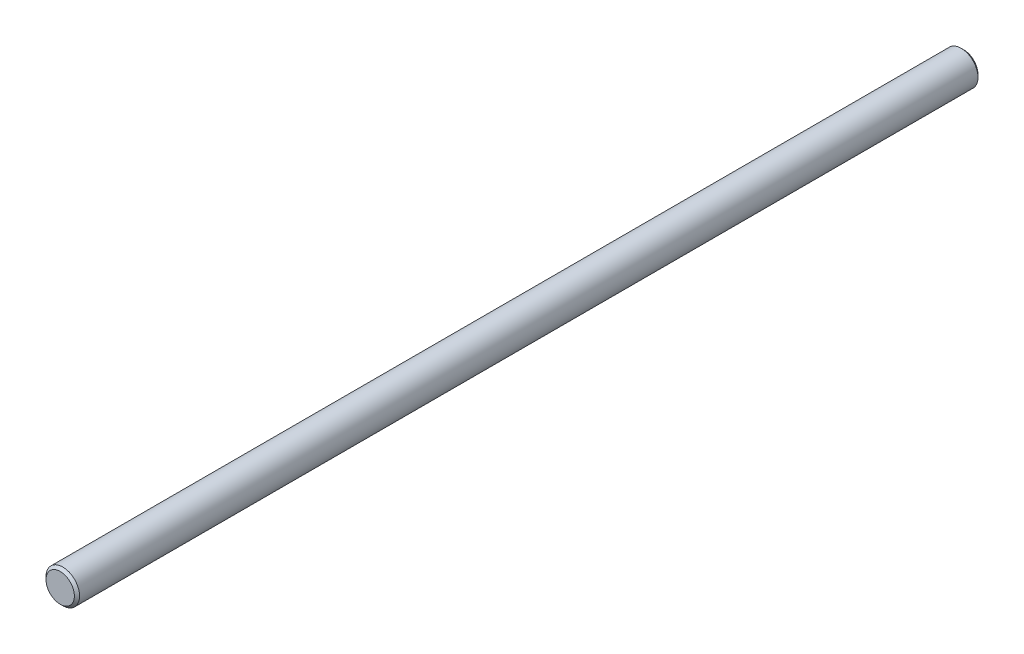
ISO-10303-21;
HEADER;
FILE_DESCRIPTION(('STEP AP214'),'2;1');
FILE_NAME('part.step','',(''),(''),'','','');
FILE_SCHEMA(('AUTOMOTIVE_DESIGN { 1 0 10303 214 1 1 1 1 }'));
ENDSEC;
DATA;
#1=APPLICATION_CONTEXT('core data for automotive mechanical design processes');
#2=APPLICATION_PROTOCOL_DEFINITION('international standard','automotive_design',2000,#1);
#3=PRODUCT_CONTEXT('',#1,'mechanical');
#4=PRODUCT('Part','Part','',(#3));
#5=PRODUCT_RELATED_PRODUCT_CATEGORY('part','',(#4));
#6=PRODUCT_DEFINITION_FORMATION('','',#4);
#7=PRODUCT_DEFINITION_CONTEXT('part definition',#1,'design');
#8=PRODUCT_DEFINITION('design','',#6,#7);
#9=PRODUCT_DEFINITION_SHAPE('','',#8);
#10=(LENGTH_UNIT() NAMED_UNIT(*) SI_UNIT(.MILLI.,.METRE.));
#11=(NAMED_UNIT(*) PLANE_ANGLE_UNIT() SI_UNIT($,.RADIAN.));
#12=(NAMED_UNIT(*) SI_UNIT($,.STERADIAN.) SOLID_ANGLE_UNIT());
#13=UNCERTAINTY_MEASURE_WITH_UNIT(LENGTH_MEASURE(1.E-05),#10,'distance_accuracy_value','');
#14=(GEOMETRIC_REPRESENTATION_CONTEXT(3) GLOBAL_UNCERTAINTY_ASSIGNED_CONTEXT((#13)) GLOBAL_UNIT_ASSIGNED_CONTEXT((#10,
#11,#12)) REPRESENTATION_CONTEXT('',''));
#15=CARTESIAN_POINT('',(0.,0.,0.));
#16=DIRECTION('',(0.,0.,1.));
#17=DIRECTION('',(1.,0.,0.));
#18=AXIS2_PLACEMENT_3D('',#15,#16,#17);
#19=CARTESIAN_POINT('',(6.49999999999996,0.,-350.));
#20=DIRECTION('',(0.,0.,1.));
#21=DIRECTION('',(1.,0.,0.));
#22=AXIS2_PLACEMENT_3D('',#19,#20,#21);
#23=PLANE('',#22);
#24=CARTESIAN_POINT('',(0.,0.,-350.));
#25=DIRECTION('',(0.,0.,1.));
#26=DIRECTION('',(1.,0.,0.));
#27=AXIS2_PLACEMENT_3D('',#24,#25,#26);
#28=CIRCLE('',#27,5.5);
#29=CARTESIAN_POINT('',(5.49999999999997,0.,-350.));
#30=VERTEX_POINT('',#29);
#31=EDGE_CURVE('E10',#30,#30,#28,.F.);
#32=ORIENTED_EDGE('',*,*,#31,.T.);
#33=EDGE_LOOP('',(#32));
#34=FACE_BOUND('',#33,.T.);
#35=ADVANCED_FACE('F30',(#34),#23,.F.);
#36=CARTESIAN_POINT('',(0.,0.,-350.));
#37=DIRECTION('',(0.,0.,-1.));
#38=DIRECTION('',(-1.,0.,0.));
#39=AXIS2_PLACEMENT_3D('',#36,#37,#38);
#40=CYLINDRICAL_SURFACE('',#39,6.5);
#41=CARTESIAN_POINT('',(0.,0.,-1.00000000000006));
#42=DIRECTION('',(0.,0.,-1.));
#43=DIRECTION('',(-1.,0.,0.));
#44=AXIS2_PLACEMENT_3D('',#41,#42,#43);
#45=CIRCLE('',#44,6.5);
#46=CARTESIAN_POINT('',(-6.5,0.,-1.00000000000006));
#47=VERTEX_POINT('',#46);
#48=EDGE_CURVE('E41',#47,#47,#45,.T.);
#49=ORIENTED_EDGE('',*,*,#48,.T.);
#50=EDGE_LOOP('',(#49));
#51=FACE_BOUND('',#50,.T.);
#52=CARTESIAN_POINT('',(0.,0.,-349.));
#53=DIRECTION('',(0.,0.,1.));
#54=DIRECTION('',(1.,0.,0.));
#55=AXIS2_PLACEMENT_3D('',#52,#53,#54);
#56=CIRCLE('',#55,6.5);
#57=CARTESIAN_POINT('',(6.49999999999996,0.,-349.));
#58=VERTEX_POINT('',#57);
#59=EDGE_CURVE('E45',#58,#58,#56,.T.);
#60=ORIENTED_EDGE('',*,*,#59,.T.);
#61=EDGE_LOOP('',(#60));
#62=FACE_BOUND('',#61,.T.);
#63=ADVANCED_FACE('F51',(#51,#62),#40,.T.);
#64=CARTESIAN_POINT('',(6.5,0.,0.));
#65=DIRECTION('',(0.,0.,-1.));
#66=DIRECTION('',(-1.,0.,0.));
#67=AXIS2_PLACEMENT_3D('',#64,#65,#66);
#68=PLANE('',#67);
#69=CARTESIAN_POINT('',(0.,0.,0.));
#70=DIRECTION('',(0.,0.,-1.));
#71=DIRECTION('',(-1.,0.,0.));
#72=AXIS2_PLACEMENT_3D('',#69,#70,#71);
#73=CIRCLE('',#72,5.49999999999992);
#74=CARTESIAN_POINT('',(-5.49999999999992,0.,0.));
#75=VERTEX_POINT('',#74);
#76=EDGE_CURVE('E37',#75,#75,#73,.F.);
#77=ORIENTED_EDGE('',*,*,#76,.T.);
#78=EDGE_LOOP('',(#77));
#79=FACE_BOUND('',#78,.T.);
#80=ADVANCED_FACE('F59',(#79),#68,.F.);
#81=CARTESIAN_POINT('',(0.,0.,-1.00000000000006));
#82=DIRECTION('',(0.,0.,-1.));
#83=DIRECTION('',(-1.,0.,0.));
#84=AXIS2_PLACEMENT_3D('',#81,#82,#83);
#85=CONICAL_SURFACE('',#84,6.5,0.785398163397459);
#86=ORIENTED_EDGE('',*,*,#76,.F.);
#87=EDGE_LOOP('',(#86));
#88=FACE_BOUND('',#87,.T.);
#89=ORIENTED_EDGE('',*,*,#48,.F.);
#90=EDGE_LOOP('',(#89));
#91=FACE_BOUND('',#90,.T.);
#92=ADVANCED_FACE('F55',(#88,#91),#85,.T.);
#93=CARTESIAN_POINT('',(0.,0.,-350.));
#94=DIRECTION('',(0.,0.,1.));
#95=DIRECTION('',(1.,0.,0.));
#96=AXIS2_PLACEMENT_3D('',#93,#94,#95);
#97=CONICAL_SURFACE('',#96,5.5,0.785398163397445);
#98=ORIENTED_EDGE('',*,*,#59,.F.);
#99=EDGE_LOOP('',(#98));
#100=FACE_BOUND('',#99,.T.);
#101=ORIENTED_EDGE('',*,*,#31,.F.);
#102=EDGE_LOOP('',(#101));
#103=FACE_BOUND('',#102,.T.);
#104=ADVANCED_FACE('F32',(#100,#103),#97,.T.);
#105=CLOSED_SHELL('',(#35,#63,#80,#92,#104));
#106=MANIFOLD_SOLID_BREP('B2',#105);
#107=ADVANCED_BREP_SHAPE_REPRESENTATION('',(#18,#106),#14);
#108=SHAPE_DEFINITION_REPRESENTATION(#9,#107);
ENDSEC;
END-ISO-10303-21;
